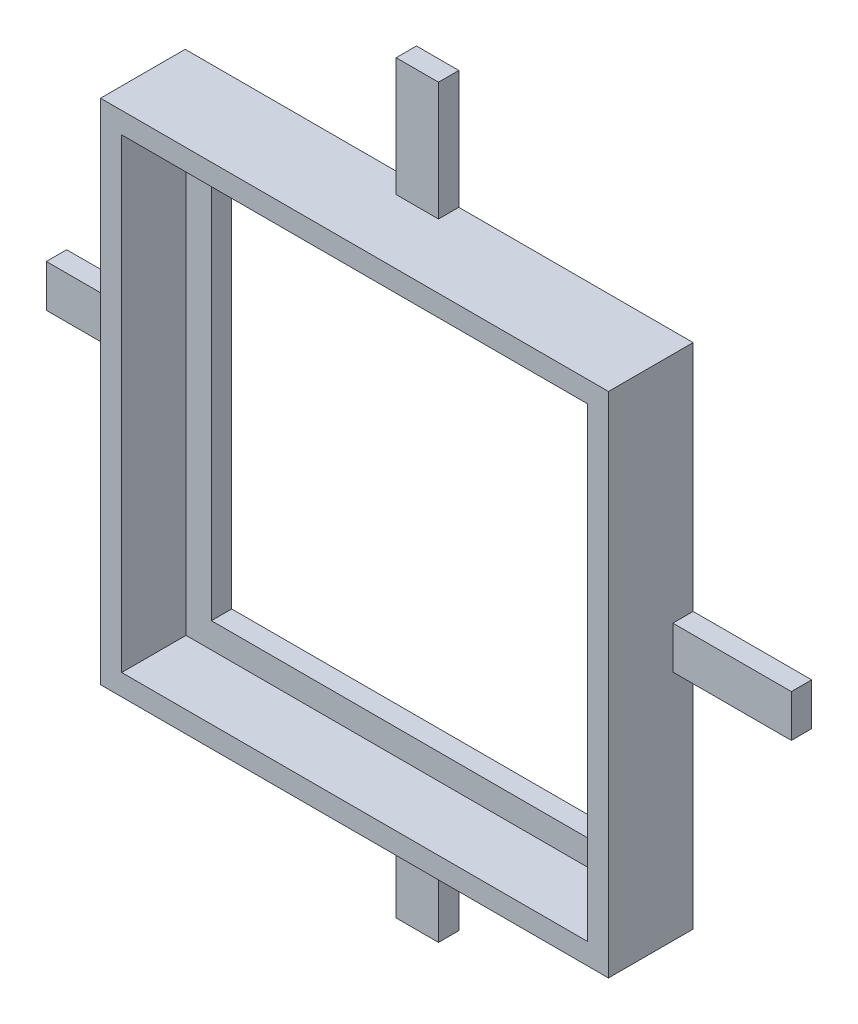
ISO-10303-21;
HEADER;
FILE_DESCRIPTION(('STEP AP214'),'2;1');
FILE_NAME('part.step','',(''),(''),'','','');
FILE_SCHEMA(('AUTOMOTIVE_DESIGN { 1 0 10303 214 1 1 1 1 }'));
ENDSEC;
DATA;
#1=APPLICATION_CONTEXT('core data for automotive mechanical design processes');
#2=APPLICATION_PROTOCOL_DEFINITION('international standard','automotive_design',2000,#1);
#3=PRODUCT_CONTEXT('',#1,'mechanical');
#4=PRODUCT('Part','Part','',(#3));
#5=PRODUCT_RELATED_PRODUCT_CATEGORY('part','',(#4));
#6=PRODUCT_DEFINITION_FORMATION('','',#4);
#7=PRODUCT_DEFINITION_CONTEXT('part definition',#1,'design');
#8=PRODUCT_DEFINITION('design','',#6,#7);
#9=PRODUCT_DEFINITION_SHAPE('','',#8);
#10=(LENGTH_UNIT() NAMED_UNIT(*) SI_UNIT(.MILLI.,.METRE.));
#11=(NAMED_UNIT(*) PLANE_ANGLE_UNIT() SI_UNIT($,.RADIAN.));
#12=(NAMED_UNIT(*) SI_UNIT($,.STERADIAN.) SOLID_ANGLE_UNIT());
#13=UNCERTAINTY_MEASURE_WITH_UNIT(LENGTH_MEASURE(1.E-05),#10,'distance_accuracy_value','');
#14=(GEOMETRIC_REPRESENTATION_CONTEXT(3) GLOBAL_UNCERTAINTY_ASSIGNED_CONTEXT((#13)) GLOBAL_UNIT_ASSIGNED_CONTEXT((#10,
#11,#12)) REPRESENTATION_CONTEXT('',''));
#15=CARTESIAN_POINT('',(0.,0.,0.));
#16=DIRECTION('',(0.,0.,1.));
#17=DIRECTION('',(1.,0.,0.));
#18=AXIS2_PLACEMENT_3D('',#15,#16,#17);
#19=CARTESIAN_POINT('',(150.,150.,50.));
#20=DIRECTION('',(-1.,0.,0.));
#21=DIRECTION('',(0.,0.,1.));
#22=AXIS2_PLACEMENT_3D('',#19,#20,#21);
#23=PLANE('',#22);
#24=DIRECTION('',(0.,0.,-1.));
#25=VECTOR('',#24,1.);
#26=CARTESIAN_POINT('',(150.,-12.5,12.));
#27=LINE('',#26,#25);
#28=CARTESIAN_POINT('',(150.,-12.5,12.));
#29=VERTEX_POINT('',#28);
#30=CARTESIAN_POINT('',(150.,-12.5,0.));
#31=VERTEX_POINT('',#30);
#32=EDGE_CURVE('E280',#29,#31,#27,.T.);
#33=ORIENTED_EDGE('',*,*,#32,.F.);
#34=DIRECTION('',(0.,-1.,0.));
#35=VECTOR('',#34,1.);
#36=CARTESIAN_POINT('',(150.,-12.5,12.));
#37=LINE('',#36,#35);
#38=CARTESIAN_POINT('',(150.,12.5,12.));
#39=VERTEX_POINT('',#38);
#40=EDGE_CURVE('E257',#39,#29,#37,.T.);
#41=ORIENTED_EDGE('',*,*,#40,.F.);
#42=DIRECTION('',(0.,0.,-1.));
#43=VECTOR('',#42,1.);
#44=CARTESIAN_POINT('',(150.,12.5,12.));
#45=LINE('',#44,#43);
#46=CARTESIAN_POINT('',(150.,12.5,0.));
#47=VERTEX_POINT('',#46);
#48=EDGE_CURVE('E253',#39,#47,#45,.T.);
#49=ORIENTED_EDGE('',*,*,#48,.T.);
#50=DIRECTION('',(0.,1.,0.));
#51=VECTOR('',#50,1.);
#52=CARTESIAN_POINT('',(150.,150.,0.));
#53=LINE('',#52,#51);
#54=CARTESIAN_POINT('',(150.,150.,0.));
#55=VERTEX_POINT('',#54);
#56=EDGE_CURVE('E477',#47,#55,#53,.T.);
#57=ORIENTED_EDGE('',*,*,#56,.T.);
#58=DIRECTION('',(0.,0.,-1.));
#59=VECTOR('',#58,1.);
#60=CARTESIAN_POINT('',(150.,150.,50.));
#61=LINE('',#60,#59);
#62=CARTESIAN_POINT('',(150.,150.,50.));
#63=VERTEX_POINT('',#62);
#64=EDGE_CURVE('E12',#63,#55,#61,.T.);
#65=ORIENTED_EDGE('',*,*,#64,.F.);
#66=DIRECTION('',(0.,1.,0.));
#67=VECTOR('',#66,1.);
#68=CARTESIAN_POINT('',(150.,150.,50.));
#69=LINE('',#68,#67);
#70=CARTESIAN_POINT('',(150.,-150.,50.));
#71=VERTEX_POINT('',#70);
#72=EDGE_CURVE('E478',#71,#63,#69,.T.);
#73=ORIENTED_EDGE('',*,*,#72,.F.);
#74=DIRECTION('',(0.,0.,-1.));
#75=VECTOR('',#74,1.);
#76=CARTESIAN_POINT('',(150.,-150.,50.));
#77=LINE('',#76,#75);
#78=CARTESIAN_POINT('',(150.,-150.,0.));
#79=VERTEX_POINT('',#78);
#80=EDGE_CURVE('E492',#71,#79,#77,.T.);
#81=ORIENTED_EDGE('',*,*,#80,.T.);
#82=EDGE_CURVE('E493',#79,#31,#53,.T.);
#83=ORIENTED_EDGE('',*,*,#82,.T.);
#84=EDGE_LOOP('',(#33,#41,#49,#57,#65,#73,#81,#83));
#85=FACE_BOUND('',#84,.T.);
#86=ADVANCED_FACE('F63',(#85),#23,.F.);
#87=CARTESIAN_POINT('',(-150.,150.,50.));
#88=DIRECTION('',(1.,0.,0.));
#89=DIRECTION('',(0.,0.,-1.));
#90=AXIS2_PLACEMENT_3D('',#87,#88,#89);
#91=PLANE('',#90);
#92=DIRECTION('',(0.,0.,-1.));
#93=VECTOR('',#92,1.);
#94=CARTESIAN_POINT('',(-150.,12.5000000000001,12.));
#95=LINE('',#94,#93);
#96=CARTESIAN_POINT('',(-150.,12.5000000000001,12.));
#97=VERTEX_POINT('',#96);
#98=CARTESIAN_POINT('',(-150.,12.5000000000001,0.));
#99=VERTEX_POINT('',#98);
#100=EDGE_CURVE('E306',#97,#99,#95,.T.);
#101=ORIENTED_EDGE('',*,*,#100,.F.);
#102=DIRECTION('',(0.,1.,0.));
#103=VECTOR('',#102,1.);
#104=CARTESIAN_POINT('',(-150.,-12.4999999999999,12.));
#105=LINE('',#104,#103);
#106=CARTESIAN_POINT('',(-150.,-12.4999999999999,12.));
#107=VERTEX_POINT('',#106);
#108=EDGE_CURVE('E292',#107,#97,#105,.T.);
#109=ORIENTED_EDGE('',*,*,#108,.F.);
#110=DIRECTION('',(0.,0.,-1.));
#111=VECTOR('',#110,1.);
#112=CARTESIAN_POINT('',(-150.,-12.4999999999999,12.));
#113=LINE('',#112,#111);
#114=CARTESIAN_POINT('',(-150.,-12.4999999999999,0.));
#115=VERTEX_POINT('',#114);
#116=EDGE_CURVE('E309',#107,#115,#113,.T.);
#117=ORIENTED_EDGE('',*,*,#116,.T.);
#118=DIRECTION('',(0.,-1.,0.));
#119=VECTOR('',#118,1.);
#120=CARTESIAN_POINT('',(-150.,150.,0.));
#121=LINE('',#120,#119);
#122=CARTESIAN_POINT('',(-150.,-150.,0.));
#123=VERTEX_POINT('',#122);
#124=EDGE_CURVE('E502',#115,#123,#121,.T.);
#125=ORIENTED_EDGE('',*,*,#124,.T.);
#126=DIRECTION('',(0.,0.,-1.));
#127=VECTOR('',#126,1.);
#128=CARTESIAN_POINT('',(-150.,-150.,50.));
#129=LINE('',#128,#127);
#130=CARTESIAN_POINT('',(-150.,-150.,50.));
#131=VERTEX_POINT('',#130);
#132=EDGE_CURVE('E514',#131,#123,#129,.T.);
#133=ORIENTED_EDGE('',*,*,#132,.F.);
#134=DIRECTION('',(0.,-1.,0.));
#135=VECTOR('',#134,1.);
#136=CARTESIAN_POINT('',(-150.,150.,50.));
#137=LINE('',#136,#135);
#138=CARTESIAN_POINT('',(-150.,150.,50.));
#139=VERTEX_POINT('',#138);
#140=EDGE_CURVE('E486',#139,#131,#137,.T.);
#141=ORIENTED_EDGE('',*,*,#140,.F.);
#142=DIRECTION('',(0.,0.,-1.));
#143=VECTOR('',#142,1.);
#144=CARTESIAN_POINT('',(-150.,150.,50.));
#145=LINE('',#144,#143);
#146=CARTESIAN_POINT('',(-150.,150.,0.));
#147=VERTEX_POINT('',#146);
#148=EDGE_CURVE('E71',#139,#147,#145,.T.);
#149=ORIENTED_EDGE('',*,*,#148,.T.);
#150=EDGE_CURVE('E503',#147,#99,#121,.T.);
#151=ORIENTED_EDGE('',*,*,#150,.T.);
#152=EDGE_LOOP('',(#101,#109,#117,#125,#133,#141,#149,#151));
#153=FACE_BOUND('',#152,.T.);
#154=ADVANCED_FACE('F524',(#153),#91,.F.);
#155=CARTESIAN_POINT('',(-150.,-150.,50.));
#156=DIRECTION('',(0.,1.,0.));
#157=DIRECTION('',(0.,0.,1.));
#158=AXIS2_PLACEMENT_3D('',#155,#156,#157);
#159=PLANE('',#158);
#160=DIRECTION('',(0.,0.,-1.));
#161=VECTOR('',#160,1.);
#162=CARTESIAN_POINT('',(-13.3901658606512,-150.,12.));
#163=LINE('',#162,#161);
#164=CARTESIAN_POINT('',(-13.3901658606512,-150.,12.));
#165=VERTEX_POINT('',#164);
#166=CARTESIAN_POINT('',(-13.3901658606512,-150.,0.));
#167=VERTEX_POINT('',#166);
#168=EDGE_CURVE('E330',#165,#167,#163,.T.);
#169=ORIENTED_EDGE('',*,*,#168,.F.);
#170=DIRECTION('',(-1.,0.,0.));
#171=VECTOR('',#170,1.);
#172=CARTESIAN_POINT('',(-13.3901658606512,-150.,12.));
#173=LINE('',#172,#171);
#174=CARTESIAN_POINT('',(11.6098341393488,-150.,12.));
#175=VERTEX_POINT('',#174);
#176=EDGE_CURVE('E327',#175,#165,#173,.T.);
#177=ORIENTED_EDGE('',*,*,#176,.F.);
#178=DIRECTION('',(0.,0.,-1.));
#179=VECTOR('',#178,1.);
#180=CARTESIAN_POINT('',(11.6098341393488,-150.,12.));
#181=LINE('',#180,#179);
#182=CARTESIAN_POINT('',(11.6098341393488,-150.,0.));
#183=VERTEX_POINT('',#182);
#184=EDGE_CURVE('E341',#175,#183,#181,.T.);
#185=ORIENTED_EDGE('',*,*,#184,.T.);
#186=DIRECTION('',(1.,0.,0.));
#187=VECTOR('',#186,1.);
#188=CARTESIAN_POINT('',(-150.,-150.,0.));
#189=LINE('',#188,#187);
#190=EDGE_CURVE('E507',#183,#79,#189,.T.);
#191=ORIENTED_EDGE('',*,*,#190,.T.);
#192=ORIENTED_EDGE('',*,*,#80,.F.);
#193=DIRECTION('',(1.,0.,0.));
#194=VECTOR('',#193,1.);
#195=CARTESIAN_POINT('',(-150.,-150.,50.));
#196=LINE('',#195,#194);
#197=EDGE_CURVE('E489',#131,#71,#196,.T.);
#198=ORIENTED_EDGE('',*,*,#197,.F.);
#199=ORIENTED_EDGE('',*,*,#132,.T.);
#200=EDGE_CURVE('E483',#123,#167,#189,.T.);
#201=ORIENTED_EDGE('',*,*,#200,.T.);
#202=EDGE_LOOP('',(#169,#177,#185,#191,#192,#198,#199,#201));
#203=FACE_BOUND('',#202,.T.);
#204=ADVANCED_FACE('F599',(#203),#159,.F.);
#205=CARTESIAN_POINT('',(-150.,150.,50.));
#206=DIRECTION('',(0.,-1.,0.));
#207=DIRECTION('',(0.,0.,-1.));
#208=AXIS2_PLACEMENT_3D('',#205,#206,#207);
#209=PLANE('',#208);
#210=DIRECTION('',(0.,0.,-1.));
#211=VECTOR('',#210,1.);
#212=CARTESIAN_POINT('',(11.6098341393487,150.,12.));
#213=LINE('',#212,#211);
#214=CARTESIAN_POINT('',(11.6098341393487,150.,12.));
#215=VERTEX_POINT('',#214);
#216=CARTESIAN_POINT('',(11.6098341393487,150.,0.));
#217=VERTEX_POINT('',#216);
#218=EDGE_CURVE('E368',#215,#217,#213,.T.);
#219=ORIENTED_EDGE('',*,*,#218,.F.);
#220=DIRECTION('',(1.,0.,0.));
#221=VECTOR('',#220,1.);
#222=CARTESIAN_POINT('',(-13.3901658606513,150.,12.));
#223=LINE('',#222,#221);
#224=CARTESIAN_POINT('',(-13.3901658606513,150.,12.));
#225=VERTEX_POINT('',#224);
#226=EDGE_CURVE('E365',#225,#215,#223,.T.);
#227=ORIENTED_EDGE('',*,*,#226,.F.);
#228=DIRECTION('',(0.,0.,-1.));
#229=VECTOR('',#228,1.);
#230=CARTESIAN_POINT('',(-13.3901658606513,150.,12.));
#231=LINE('',#230,#229);
#232=CARTESIAN_POINT('',(-13.3901658606513,150.,0.));
#233=VERTEX_POINT('',#232);
#234=EDGE_CURVE('E379',#225,#233,#231,.T.);
#235=ORIENTED_EDGE('',*,*,#234,.T.);
#236=DIRECTION('',(-1.,0.,0.));
#237=VECTOR('',#236,1.);
#238=CARTESIAN_POINT('',(-150.,150.,0.));
#239=LINE('',#238,#237);
#240=EDGE_CURVE('E497',#233,#147,#239,.T.);
#241=ORIENTED_EDGE('',*,*,#240,.T.);
#242=ORIENTED_EDGE('',*,*,#148,.F.);
#243=DIRECTION('',(-1.,0.,0.));
#244=VECTOR('',#243,1.);
#245=CARTESIAN_POINT('',(-150.,150.,50.));
#246=LINE('',#245,#244);
#247=EDGE_CURVE('E482',#63,#139,#246,.T.);
#248=ORIENTED_EDGE('',*,*,#247,.F.);
#249=ORIENTED_EDGE('',*,*,#64,.T.);
#250=EDGE_CURVE('E498',#55,#217,#239,.T.);
#251=ORIENTED_EDGE('',*,*,#250,.T.);
#252=EDGE_LOOP('',(#219,#227,#235,#241,#242,#248,#249,#251));
#253=FACE_BOUND('',#252,.T.);
#254=ADVANCED_FACE('F561',(#253),#209,.F.);
#255=CARTESIAN_POINT('',(137.5,137.5,50.));
#256=DIRECTION('',(-1.,0.,0.));
#257=DIRECTION('',(0.,-1.,0.));
#258=AXIS2_PLACEMENT_3D('',#255,#256,#257);
#259=PLANE('',#258);
#260=DIRECTION('',(0.,0.,-1.));
#261=VECTOR('',#260,1.);
#262=CARTESIAN_POINT('',(137.5,137.5,50.));
#263=LINE('',#262,#261);
#264=CARTESIAN_POINT('',(137.5,137.5,50.));
#265=VERTEX_POINT('',#264);
#266=CARTESIAN_POINT('',(137.5,137.5,12.));
#267=VERTEX_POINT('',#266);
#268=EDGE_CURVE('E473',#265,#267,#263,.T.);
#269=ORIENTED_EDGE('',*,*,#268,.T.);
#270=DIRECTION('',(0.,-1.,0.));
#271=VECTOR('',#270,1.);
#272=CARTESIAN_POINT('',(137.5,137.5,12.));
#273=LINE('',#272,#271);
#274=CARTESIAN_POINT('',(137.5,-137.5,12.));
#275=VERTEX_POINT('',#274);
#276=EDGE_CURVE('E437',#267,#275,#273,.T.);
#277=ORIENTED_EDGE('',*,*,#276,.T.);
#278=DIRECTION('',(0.,0.,-1.));
#279=VECTOR('',#278,1.);
#280=CARTESIAN_POINT('',(137.5,-137.5,50.));
#281=LINE('',#280,#279);
#282=CARTESIAN_POINT('',(137.5,-137.5,50.));
#283=VERTEX_POINT('',#282);
#284=EDGE_CURVE('E461',#283,#275,#281,.T.);
#285=ORIENTED_EDGE('',*,*,#284,.F.);
#286=DIRECTION('',(0.,1.,0.));
#287=VECTOR('',#286,1.);
#288=CARTESIAN_POINT('',(137.5,137.5,50.));
#289=LINE('',#288,#287);
#290=EDGE_CURVE('E448',#283,#265,#289,.T.);
#291=ORIENTED_EDGE('',*,*,#290,.T.);
#292=EDGE_LOOP('',(#269,#277,#285,#291));
#293=FACE_BOUND('',#292,.T.);
#294=ADVANCED_FACE('F607',(#293),#259,.T.);
#295=CARTESIAN_POINT('',(-137.5,137.5,50.));
#296=DIRECTION('',(0.,-1.,0.));
#297=DIRECTION('',(0.,0.,-1.));
#298=AXIS2_PLACEMENT_3D('',#295,#296,#297);
#299=PLANE('',#298);
#300=DIRECTION('',(0.,0.,-1.));
#301=VECTOR('',#300,1.);
#302=CARTESIAN_POINT('',(-137.5,137.5,50.));
#303=LINE('',#302,#301);
#304=CARTESIAN_POINT('',(-137.5,137.5,50.));
#305=VERTEX_POINT('',#304);
#306=CARTESIAN_POINT('',(-137.5,137.5,12.));
#307=VERTEX_POINT('',#306);
#308=EDGE_CURVE('E469',#305,#307,#303,.T.);
#309=ORIENTED_EDGE('',*,*,#308,.T.);
#310=DIRECTION('',(1.,0.,0.));
#311=VECTOR('',#310,1.);
#312=CARTESIAN_POINT('',(-137.5,137.5,12.));
#313=LINE('',#312,#311);
#314=EDGE_CURVE('E441',#307,#267,#313,.T.);
#315=ORIENTED_EDGE('',*,*,#314,.T.);
#316=ORIENTED_EDGE('',*,*,#268,.F.);
#317=DIRECTION('',(-1.,0.,0.));
#318=VECTOR('',#317,1.);
#319=CARTESIAN_POINT('',(-137.5,137.5,50.));
#320=LINE('',#319,#318);
#321=EDGE_CURVE('E451',#265,#305,#320,.T.);
#322=ORIENTED_EDGE('',*,*,#321,.T.);
#323=EDGE_LOOP('',(#309,#315,#316,#322));
#324=FACE_BOUND('',#323,.T.);
#325=ADVANCED_FACE('F611',(#324),#299,.T.);
#326=CARTESIAN_POINT('',(-137.5,137.5,50.));
#327=DIRECTION('',(1.,0.,0.));
#328=DIRECTION('',(0.,1.,0.));
#329=AXIS2_PLACEMENT_3D('',#326,#327,#328);
#330=PLANE('',#329);
#331=DIRECTION('',(0.,0.,-1.));
#332=VECTOR('',#331,1.);
#333=CARTESIAN_POINT('',(-137.5,-137.5,50.));
#334=LINE('',#333,#332);
#335=CARTESIAN_POINT('',(-137.5,-137.5,50.));
#336=VERTEX_POINT('',#335);
#337=CARTESIAN_POINT('',(-137.5,-137.5,12.));
#338=VERTEX_POINT('',#337);
#339=EDGE_CURVE('E465',#336,#338,#334,.T.);
#340=ORIENTED_EDGE('',*,*,#339,.T.);
#341=DIRECTION('',(0.,-1.,0.));
#342=VECTOR('',#341,1.);
#343=CARTESIAN_POINT('',(-137.5,137.5,12.));
#344=LINE('',#343,#342);
#345=EDGE_CURVE('E445',#307,#338,#344,.T.);
#346=ORIENTED_EDGE('',*,*,#345,.F.);
#347=ORIENTED_EDGE('',*,*,#308,.F.);
#348=DIRECTION('',(0.,-1.,0.));
#349=VECTOR('',#348,1.);
#350=CARTESIAN_POINT('',(-137.5,137.5,50.));
#351=LINE('',#350,#349);
#352=EDGE_CURVE('E454',#305,#336,#351,.T.);
#353=ORIENTED_EDGE('',*,*,#352,.T.);
#354=EDGE_LOOP('',(#340,#346,#347,#353));
#355=FACE_BOUND('',#354,.T.);
#356=ADVANCED_FACE('F617',(#355),#330,.T.);
#357=CARTESIAN_POINT('',(-137.5,-137.5,50.));
#358=DIRECTION('',(0.,1.,0.));
#359=DIRECTION('',(0.,0.,1.));
#360=AXIS2_PLACEMENT_3D('',#357,#358,#359);
#361=PLANE('',#360);
#362=ORIENTED_EDGE('',*,*,#284,.T.);
#363=DIRECTION('',(1.,0.,0.));
#364=VECTOR('',#363,1.);
#365=CARTESIAN_POINT('',(-137.5,-137.5,12.));
#366=LINE('',#365,#364);
#367=EDGE_CURVE('E434',#338,#275,#366,.T.);
#368=ORIENTED_EDGE('',*,*,#367,.F.);
#369=ORIENTED_EDGE('',*,*,#339,.F.);
#370=DIRECTION('',(1.,0.,0.));
#371=VECTOR('',#370,1.);
#372=CARTESIAN_POINT('',(-137.5,-137.5,50.));
#373=LINE('',#372,#371);
#374=EDGE_CURVE('E458',#336,#283,#373,.T.);
#375=ORIENTED_EDGE('',*,*,#374,.T.);
#376=EDGE_LOOP('',(#362,#368,#369,#375));
#377=FACE_BOUND('',#376,.T.);
#378=ADVANCED_FACE('F623',(#377),#361,.T.);
#379=CARTESIAN_POINT('',(0.,0.,50.));
#380=DIRECTION('',(0.,0.,1.));
#381=DIRECTION('',(1.,0.,0.));
#382=AXIS2_PLACEMENT_3D('',#379,#380,#381);
#383=PLANE('',#382);
#384=ORIENTED_EDGE('',*,*,#72,.T.);
#385=ORIENTED_EDGE('',*,*,#247,.T.);
#386=ORIENTED_EDGE('',*,*,#140,.T.);
#387=ORIENTED_EDGE('',*,*,#197,.T.);
#388=EDGE_LOOP('',(#384,#385,#386,#387));
#389=FACE_BOUND('',#388,.T.);
#390=ORIENTED_EDGE('',*,*,#321,.F.);
#391=ORIENTED_EDGE('',*,*,#290,.F.);
#392=ORIENTED_EDGE('',*,*,#374,.F.);
#393=ORIENTED_EDGE('',*,*,#352,.F.);
#394=EDGE_LOOP('',(#390,#391,#392,#393));
#395=FACE_BOUND('',#394,.T.);
#396=ADVANCED_FACE('F563',(#389,#395),#383,.T.);
#397=CARTESIAN_POINT('',(0.,0.,0.));
#398=DIRECTION('',(0.,0.,1.));
#399=DIRECTION('',(1.,0.,0.));
#400=AXIS2_PLACEMENT_3D('',#397,#398,#399);
#401=PLANE('',#400);
#402=ORIENTED_EDGE('',*,*,#82,.F.);
#403=ORIENTED_EDGE('',*,*,#190,.F.);
#404=DIRECTION('',(0.,1.,0.));
#405=VECTOR('',#404,1.);
#406=CARTESIAN_POINT('',(11.6098341393488,-150.,0.));
#407=LINE('',#406,#405);
#408=CARTESIAN_POINT('',(11.6098341393488,-220.,0.));
#409=VERTEX_POINT('',#408);
#410=EDGE_CURVE('E321',#409,#183,#407,.T.);
#411=ORIENTED_EDGE('',*,*,#410,.F.);
#412=DIRECTION('',(1.,0.,0.));
#413=VECTOR('',#412,1.);
#414=CARTESIAN_POINT('',(-13.3901658606512,-220.,0.));
#415=LINE('',#414,#413);
#416=CARTESIAN_POINT('',(-13.3901658606512,-220.,0.));
#417=VERTEX_POINT('',#416);
#418=EDGE_CURVE('E334',#417,#409,#415,.T.);
#419=ORIENTED_EDGE('',*,*,#418,.F.);
#420=DIRECTION('',(0.,-1.,0.));
#421=VECTOR('',#420,1.);
#422=CARTESIAN_POINT('',(-13.3901658606512,-150.,0.));
#423=LINE('',#422,#421);
#424=EDGE_CURVE('E315',#167,#417,#423,.T.);
#425=ORIENTED_EDGE('',*,*,#424,.F.);
#426=ORIENTED_EDGE('',*,*,#200,.F.);
#427=ORIENTED_EDGE('',*,*,#124,.F.);
#428=DIRECTION('',(1.,0.,0.));
#429=VECTOR('',#428,1.);
#430=CARTESIAN_POINT('',(-150.,-12.4999999999999,0.));
#431=LINE('',#430,#429);
#432=CARTESIAN_POINT('',(-220.,-12.4999999999998,0.));
#433=VERTEX_POINT('',#432);
#434=EDGE_CURVE('E86',#433,#115,#431,.T.);
#435=ORIENTED_EDGE('',*,*,#434,.F.);
#436=DIRECTION('',(0.,-1.,0.));
#437=VECTOR('',#436,1.);
#438=CARTESIAN_POINT('',(-220.,12.5000000000002,0.));
#439=LINE('',#438,#437);
#440=CARTESIAN_POINT('',(-220.,12.5000000000002,0.));
#441=VERTEX_POINT('',#440);
#442=EDGE_CURVE('E274',#441,#433,#439,.T.);
#443=ORIENTED_EDGE('',*,*,#442,.F.);
#444=DIRECTION('',(-1.,0.,0.));
#445=VECTOR('',#444,1.);
#446=CARTESIAN_POINT('',(-150.,12.5000000000001,0.));
#447=LINE('',#446,#445);
#448=EDGE_CURVE('E289',#99,#441,#447,.T.);
#449=ORIENTED_EDGE('',*,*,#448,.F.);
#450=ORIENTED_EDGE('',*,*,#150,.F.);
#451=ORIENTED_EDGE('',*,*,#240,.F.);
#452=DIRECTION('',(0.,-1.,0.));
#453=VECTOR('',#452,1.);
#454=CARTESIAN_POINT('',(-13.3901658606513,150.,0.));
#455=LINE('',#454,#453);
#456=CARTESIAN_POINT('',(-13.3901658606513,220.,0.));
#457=VERTEX_POINT('',#456);
#458=EDGE_CURVE('E359',#457,#233,#455,.T.);
#459=ORIENTED_EDGE('',*,*,#458,.F.);
#460=DIRECTION('',(-1.,0.,0.));
#461=VECTOR('',#460,1.);
#462=CARTESIAN_POINT('',(-13.3901658606513,220.,0.));
#463=LINE('',#462,#461);
#464=CARTESIAN_POINT('',(11.6098341393487,220.,0.));
#465=VERTEX_POINT('',#464);
#466=EDGE_CURVE('E372',#465,#457,#463,.T.);
#467=ORIENTED_EDGE('',*,*,#466,.F.);
#468=DIRECTION('',(0.,1.,0.));
#469=VECTOR('',#468,1.);
#470=CARTESIAN_POINT('',(11.6098341393487,150.,0.));
#471=LINE('',#470,#469);
#472=EDGE_CURVE('E353',#217,#465,#471,.T.);
#473=ORIENTED_EDGE('',*,*,#472,.F.);
#474=ORIENTED_EDGE('',*,*,#250,.F.);
#475=ORIENTED_EDGE('',*,*,#56,.F.);
#476=DIRECTION('',(-1.,0.,0.));
#477=VECTOR('',#476,1.);
#478=CARTESIAN_POINT('',(150.,12.5,0.));
#479=LINE('',#478,#477);
#480=CARTESIAN_POINT('',(220.,12.5,0.));
#481=VERTEX_POINT('',#480);
#482=EDGE_CURVE('E78',#481,#47,#479,.T.);
#483=ORIENTED_EDGE('',*,*,#482,.F.);
#484=DIRECTION('',(0.,1.,0.));
#485=VECTOR('',#484,1.);
#486=CARTESIAN_POINT('',(220.,12.5,0.));
#487=LINE('',#486,#485);
#488=CARTESIAN_POINT('',(220.,-12.5,0.));
#489=VERTEX_POINT('',#488);
#490=EDGE_CURVE('E272',#489,#481,#487,.T.);
#491=ORIENTED_EDGE('',*,*,#490,.F.);
#492=DIRECTION('',(1.,0.,0.));
#493=VECTOR('',#492,1.);
#494=CARTESIAN_POINT('',(150.,-12.5,0.));
#495=LINE('',#494,#493);
#496=EDGE_CURVE('E268',#31,#489,#495,.T.);
#497=ORIENTED_EDGE('',*,*,#496,.F.);
#498=EDGE_LOOP('',(#402,#403,#411,#419,#425,#426,#427,#435,#443,#449,#450,#451,#459,#467,#473,
#474,#475,#483,#491,#497));
#499=FACE_BOUND('',#498,.T.);
#500=DIRECTION('',(0.,-1.,0.));
#501=VECTOR('',#500,1.);
#502=CARTESIAN_POINT('',(-122.5,122.5,0.));
#503=LINE('',#502,#501);
#504=CARTESIAN_POINT('',(-122.5,122.5,0.));
#505=VERTEX_POINT('',#504);
#506=CARTESIAN_POINT('',(-122.5,-122.5,0.));
#507=VERTEX_POINT('',#506);
#508=EDGE_CURVE('E396',#505,#507,#503,.T.);
#509=ORIENTED_EDGE('',*,*,#508,.T.);
#510=DIRECTION('',(1.,0.,0.));
#511=VECTOR('',#510,1.);
#512=CARTESIAN_POINT('',(-122.5,-122.5,0.));
#513=LINE('',#512,#511);
#514=CARTESIAN_POINT('',(122.5,-122.5,0.));
#515=VERTEX_POINT('',#514);
#516=EDGE_CURVE('E391',#507,#515,#513,.T.);
#517=ORIENTED_EDGE('',*,*,#516,.T.);
#518=DIRECTION('',(0.,-1.,0.));
#519=VECTOR('',#518,1.);
#520=CARTESIAN_POINT('',(122.5,122.5,0.));
#521=LINE('',#520,#519);
#522=CARTESIAN_POINT('',(122.5,122.5,0.));
#523=VERTEX_POINT('',#522);
#524=EDGE_CURVE('E411',#523,#515,#521,.T.);
#525=ORIENTED_EDGE('',*,*,#524,.F.);
#526=DIRECTION('',(1.,0.,0.));
#527=VECTOR('',#526,1.);
#528=CARTESIAN_POINT('',(-122.5,122.5,0.));
#529=LINE('',#528,#527);
#530=EDGE_CURVE('E415',#505,#523,#529,.T.);
#531=ORIENTED_EDGE('',*,*,#530,.F.);
#532=EDGE_LOOP('',(#509,#517,#525,#531));
#533=FACE_BOUND('',#532,.T.);
#534=ADVANCED_FACE('F531',(#499,#533),#401,.F.);
#535=CARTESIAN_POINT('',(0.,0.,12.));
#536=DIRECTION('',(0.,0.,-1.));
#537=DIRECTION('',(-1.,0.,0.));
#538=AXIS2_PLACEMENT_3D('',#535,#536,#537);
#539=PLANE('',#538);
#540=ORIENTED_EDGE('',*,*,#367,.T.);
#541=ORIENTED_EDGE('',*,*,#276,.F.);
#542=ORIENTED_EDGE('',*,*,#314,.F.);
#543=ORIENTED_EDGE('',*,*,#345,.T.);
#544=EDGE_LOOP('',(#540,#541,#542,#543));
#545=FACE_BOUND('',#544,.T.);
#546=DIRECTION('',(1.,0.,0.));
#547=VECTOR('',#546,1.);
#548=CARTESIAN_POINT('',(-122.5,-122.5,12.));
#549=LINE('',#548,#547);
#550=CARTESIAN_POINT('',(-122.5,-122.5,12.));
#551=VERTEX_POINT('',#550);
#552=CARTESIAN_POINT('',(122.5,-122.5,12.));
#553=VERTEX_POINT('',#552);
#554=EDGE_CURVE('E392',#551,#553,#549,.T.);
#555=ORIENTED_EDGE('',*,*,#554,.F.);
#556=DIRECTION('',(0.,-1.,0.));
#557=VECTOR('',#556,1.);
#558=CARTESIAN_POINT('',(-122.5,122.5,12.));
#559=LINE('',#558,#557);
#560=CARTESIAN_POINT('',(-122.5,122.5,12.));
#561=VERTEX_POINT('',#560);
#562=EDGE_CURVE('E404',#561,#551,#559,.T.);
#563=ORIENTED_EDGE('',*,*,#562,.F.);
#564=DIRECTION('',(1.,0.,0.));
#565=VECTOR('',#564,1.);
#566=CARTESIAN_POINT('',(-122.5,122.5,12.));
#567=LINE('',#566,#565);
#568=CARTESIAN_POINT('',(122.5,122.5,12.));
#569=VERTEX_POINT('',#568);
#570=EDGE_CURVE('E400',#561,#569,#567,.T.);
#571=ORIENTED_EDGE('',*,*,#570,.T.);
#572=DIRECTION('',(0.,-1.,0.));
#573=VECTOR('',#572,1.);
#574=CARTESIAN_POINT('',(122.5,122.5,12.));
#575=LINE('',#574,#573);
#576=EDGE_CURVE('E395',#569,#553,#575,.T.);
#577=ORIENTED_EDGE('',*,*,#576,.T.);
#578=EDGE_LOOP('',(#555,#563,#571,#577));
#579=FACE_BOUND('',#578,.T.);
#580=ADVANCED_FACE('F625',(#545,#579),#539,.F.);
#581=CARTESIAN_POINT('',(-122.5,-122.5,12.));
#582=DIRECTION('',(0.,1.,0.));
#583=DIRECTION('',(0.,0.,1.));
#584=AXIS2_PLACEMENT_3D('',#581,#582,#583);
#585=PLANE('',#584);
#586=ORIENTED_EDGE('',*,*,#516,.F.);
#587=DIRECTION('',(0.,0.,-1.));
#588=VECTOR('',#587,1.);
#589=CARTESIAN_POINT('',(-122.5,-122.5,12.));
#590=LINE('',#589,#588);
#591=EDGE_CURVE('E407',#551,#507,#590,.T.);
#592=ORIENTED_EDGE('',*,*,#591,.F.);
#593=ORIENTED_EDGE('',*,*,#554,.T.);
#594=DIRECTION('',(0.,0.,-1.));
#595=VECTOR('',#594,1.);
#596=CARTESIAN_POINT('',(122.5,-122.5,12.));
#597=LINE('',#596,#595);
#598=EDGE_CURVE('E431',#553,#515,#597,.T.);
#599=ORIENTED_EDGE('',*,*,#598,.T.);
#600=EDGE_LOOP('',(#586,#592,#593,#599));
#601=FACE_BOUND('',#600,.T.);
#602=ADVANCED_FACE('F629',(#601),#585,.T.);
#603=CARTESIAN_POINT('',(122.5,122.5,12.));
#604=DIRECTION('',(1.,0.,0.));
#605=DIRECTION('',(0.,1.,0.));
#606=AXIS2_PLACEMENT_3D('',#603,#604,#605);
#607=PLANE('',#606);
#608=ORIENTED_EDGE('',*,*,#524,.T.);
#609=ORIENTED_EDGE('',*,*,#598,.F.);
#610=ORIENTED_EDGE('',*,*,#576,.F.);
#611=DIRECTION('',(0.,0.,-1.));
#612=VECTOR('',#611,1.);
#613=CARTESIAN_POINT('',(122.5,122.5,12.));
#614=LINE('',#613,#612);
#615=EDGE_CURVE('E428',#569,#523,#614,.T.);
#616=ORIENTED_EDGE('',*,*,#615,.T.);
#617=EDGE_LOOP('',(#608,#609,#610,#616));
#618=FACE_BOUND('',#617,.T.);
#619=ADVANCED_FACE('F635',(#618),#607,.F.);
#620=CARTESIAN_POINT('',(-122.5,122.5,12.));
#621=DIRECTION('',(0.,1.,0.));
#622=DIRECTION('',(0.,0.,1.));
#623=AXIS2_PLACEMENT_3D('',#620,#621,#622);
#624=PLANE('',#623);
#625=ORIENTED_EDGE('',*,*,#530,.T.);
#626=ORIENTED_EDGE('',*,*,#615,.F.);
#627=ORIENTED_EDGE('',*,*,#570,.F.);
#628=DIRECTION('',(0.,0.,-1.));
#629=VECTOR('',#628,1.);
#630=CARTESIAN_POINT('',(-122.5,122.5,12.));
#631=LINE('',#630,#629);
#632=EDGE_CURVE('E425',#561,#505,#631,.T.);
#633=ORIENTED_EDGE('',*,*,#632,.T.);
#634=EDGE_LOOP('',(#625,#626,#627,#633));
#635=FACE_BOUND('',#634,.T.);
#636=ADVANCED_FACE('F708',(#635),#624,.F.);
#637=CARTESIAN_POINT('',(-122.5,122.5,12.));
#638=DIRECTION('',(1.,0.,0.));
#639=DIRECTION('',(0.,1.,0.));
#640=AXIS2_PLACEMENT_3D('',#637,#638,#639);
#641=PLANE('',#640);
#642=ORIENTED_EDGE('',*,*,#508,.F.);
#643=ORIENTED_EDGE('',*,*,#632,.F.);
#644=ORIENTED_EDGE('',*,*,#562,.T.);
#645=ORIENTED_EDGE('',*,*,#591,.T.);
#646=EDGE_LOOP('',(#642,#643,#644,#645));
#647=FACE_BOUND('',#646,.T.);
#648=ADVANCED_FACE('F716',(#647),#641,.T.);
#649=CARTESIAN_POINT('',(11.6098341393487,150.,12.));
#650=DIRECTION('',(-1.,0.,0.));
#651=DIRECTION('',(0.,0.,1.));
#652=AXIS2_PLACEMENT_3D('',#649,#650,#651);
#653=PLANE('',#652);
#654=ORIENTED_EDGE('',*,*,#472,.T.);
#655=DIRECTION('',(0.,0.,-1.));
#656=VECTOR('',#655,1.);
#657=CARTESIAN_POINT('',(11.6098341393487,220.,12.));
#658=LINE('',#657,#656);
#659=CARTESIAN_POINT('',(11.6098341393487,220.,12.));
#660=VERTEX_POINT('',#659);
#661=EDGE_CURVE('E387',#660,#465,#658,.T.);
#662=ORIENTED_EDGE('',*,*,#661,.F.);
#663=DIRECTION('',(0.,1.,0.));
#664=VECTOR('',#663,1.);
#665=CARTESIAN_POINT('',(11.6098341393487,150.,12.));
#666=LINE('',#665,#664);
#667=EDGE_CURVE('E354',#215,#660,#666,.T.);
#668=ORIENTED_EDGE('',*,*,#667,.F.);
#669=ORIENTED_EDGE('',*,*,#218,.T.);
#670=EDGE_LOOP('',(#654,#662,#668,#669));
#671=FACE_BOUND('',#670,.T.);
#672=ADVANCED_FACE('F725',(#671),#653,.F.);
#673=CARTESIAN_POINT('',(-13.3901658606513,220.,12.));
#674=DIRECTION('',(0.,-1.,0.));
#675=DIRECTION('',(0.,0.,-1.));
#676=AXIS2_PLACEMENT_3D('',#673,#674,#675);
#677=PLANE('',#676);
#678=ORIENTED_EDGE('',*,*,#466,.T.);
#679=DIRECTION('',(0.,0.,-1.));
#680=VECTOR('',#679,1.);
#681=CARTESIAN_POINT('',(-13.3901658606513,220.,12.));
#682=LINE('',#681,#680);
#683=CARTESIAN_POINT('',(-13.3901658606513,220.,12.));
#684=VERTEX_POINT('',#683);
#685=EDGE_CURVE('E383',#684,#457,#682,.T.);
#686=ORIENTED_EDGE('',*,*,#685,.F.);
#687=DIRECTION('',(-1.,0.,0.));
#688=VECTOR('',#687,1.);
#689=CARTESIAN_POINT('',(-13.3901658606513,220.,12.));
#690=LINE('',#689,#688);
#691=EDGE_CURVE('E358',#660,#684,#690,.T.);
#692=ORIENTED_EDGE('',*,*,#691,.F.);
#693=ORIENTED_EDGE('',*,*,#661,.T.);
#694=EDGE_LOOP('',(#678,#686,#692,#693));
#695=FACE_BOUND('',#694,.T.);
#696=ADVANCED_FACE('F755',(#695),#677,.F.);
#697=CARTESIAN_POINT('',(-13.3901658606513,150.,12.));
#698=DIRECTION('',(1.,0.,0.));
#699=DIRECTION('',(0.,0.,-1.));
#700=AXIS2_PLACEMENT_3D('',#697,#698,#699);
#701=PLANE('',#700);
#702=ORIENTED_EDGE('',*,*,#458,.T.);
#703=ORIENTED_EDGE('',*,*,#234,.F.);
#704=DIRECTION('',(0.,-1.,0.));
#705=VECTOR('',#704,1.);
#706=CARTESIAN_POINT('',(-13.3901658606513,150.,12.));
#707=LINE('',#706,#705);
#708=EDGE_CURVE('E362',#684,#225,#707,.T.);
#709=ORIENTED_EDGE('',*,*,#708,.F.);
#710=ORIENTED_EDGE('',*,*,#685,.T.);
#711=EDGE_LOOP('',(#702,#703,#709,#710));
#712=FACE_BOUND('',#711,.T.);
#713=ADVANCED_FACE('F765',(#712),#701,.F.);
#714=CARTESIAN_POINT('',(0.,0.,12.));
#715=DIRECTION('',(0.,0.,-1.));
#716=DIRECTION('',(-1.,0.,0.));
#717=AXIS2_PLACEMENT_3D('',#714,#715,#716);
#718=PLANE('',#717);
#719=ORIENTED_EDGE('',*,*,#667,.T.);
#720=ORIENTED_EDGE('',*,*,#691,.T.);
#721=ORIENTED_EDGE('',*,*,#708,.T.);
#722=ORIENTED_EDGE('',*,*,#226,.T.);
#723=EDGE_LOOP('',(#719,#720,#721,#722));
#724=FACE_BOUND('',#723,.T.);
#725=ADVANCED_FACE('F775',(#724),#718,.F.);
#726=CARTESIAN_POINT('',(-13.3901658606512,-150.,12.));
#727=DIRECTION('',(1.,0.,0.));
#728=DIRECTION('',(0.,1.,0.));
#729=AXIS2_PLACEMENT_3D('',#726,#727,#728);
#730=PLANE('',#729);
#731=ORIENTED_EDGE('',*,*,#424,.T.);
#732=DIRECTION('',(0.,0.,-1.));
#733=VECTOR('',#732,1.);
#734=CARTESIAN_POINT('',(-13.3901658606512,-220.,12.));
#735=LINE('',#734,#733);
#736=CARTESIAN_POINT('',(-13.3901658606512,-220.,12.));
#737=VERTEX_POINT('',#736);
#738=EDGE_CURVE('E349',#737,#417,#735,.T.);
#739=ORIENTED_EDGE('',*,*,#738,.F.);
#740=DIRECTION('',(0.,-1.,0.));
#741=VECTOR('',#740,1.);
#742=CARTESIAN_POINT('',(-13.3901658606512,-150.,12.));
#743=LINE('',#742,#741);
#744=EDGE_CURVE('E316',#165,#737,#743,.T.);
#745=ORIENTED_EDGE('',*,*,#744,.F.);
#746=ORIENTED_EDGE('',*,*,#168,.T.);
#747=EDGE_LOOP('',(#731,#739,#745,#746));
#748=FACE_BOUND('',#747,.T.);
#749=ADVANCED_FACE('F785',(#748),#730,.F.);
#750=CARTESIAN_POINT('',(-13.3901658606512,-220.,12.));
#751=DIRECTION('',(0.,1.,0.));
#752=DIRECTION('',(0.,0.,1.));
#753=AXIS2_PLACEMENT_3D('',#750,#751,#752);
#754=PLANE('',#753);
#755=ORIENTED_EDGE('',*,*,#418,.T.);
#756=DIRECTION('',(0.,0.,-1.));
#757=VECTOR('',#756,1.);
#758=CARTESIAN_POINT('',(11.6098341393488,-220.,12.));
#759=LINE('',#758,#757);
#760=CARTESIAN_POINT('',(11.6098341393488,-220.,12.));
#761=VERTEX_POINT('',#760);
#762=EDGE_CURVE('E345',#761,#409,#759,.T.);
#763=ORIENTED_EDGE('',*,*,#762,.F.);
#764=DIRECTION('',(1.,0.,0.));
#765=VECTOR('',#764,1.);
#766=CARTESIAN_POINT('',(-13.3901658606512,-220.,12.));
#767=LINE('',#766,#765);
#768=EDGE_CURVE('E320',#737,#761,#767,.T.);
#769=ORIENTED_EDGE('',*,*,#768,.F.);
#770=ORIENTED_EDGE('',*,*,#738,.T.);
#771=EDGE_LOOP('',(#755,#763,#769,#770));
#772=FACE_BOUND('',#771,.T.);
#773=ADVANCED_FACE('F795',(#772),#754,.F.);
#774=CARTESIAN_POINT('',(11.6098341393488,-150.,12.));
#775=DIRECTION('',(-1.,0.,0.));
#776=DIRECTION('',(0.,-1.,0.));
#777=AXIS2_PLACEMENT_3D('',#774,#775,#776);
#778=PLANE('',#777);
#779=ORIENTED_EDGE('',*,*,#410,.T.);
#780=ORIENTED_EDGE('',*,*,#184,.F.);
#781=DIRECTION('',(0.,1.,0.));
#782=VECTOR('',#781,1.);
#783=CARTESIAN_POINT('',(11.6098341393488,-150.,12.));
#784=LINE('',#783,#782);
#785=EDGE_CURVE('E324',#761,#175,#784,.T.);
#786=ORIENTED_EDGE('',*,*,#785,.F.);
#787=ORIENTED_EDGE('',*,*,#762,.T.);
#788=EDGE_LOOP('',(#779,#780,#786,#787));
#789=FACE_BOUND('',#788,.T.);
#790=ADVANCED_FACE('F805',(#789),#778,.F.);
#791=CARTESIAN_POINT('',(0.,0.,12.));
#792=DIRECTION('',(0.,0.,1.));
#793=DIRECTION('',(1.,0.,0.));
#794=AXIS2_PLACEMENT_3D('',#791,#792,#793);
#795=PLANE('',#794);
#796=ORIENTED_EDGE('',*,*,#744,.T.);
#797=ORIENTED_EDGE('',*,*,#768,.T.);
#798=ORIENTED_EDGE('',*,*,#785,.T.);
#799=ORIENTED_EDGE('',*,*,#176,.T.);
#800=EDGE_LOOP('',(#796,#797,#798,#799));
#801=FACE_BOUND('',#800,.T.);
#802=ADVANCED_FACE('F815',(#801),#795,.T.);
#803=CARTESIAN_POINT('',(-220.,12.5000000000002,12.));
#804=DIRECTION('',(1.,0.,0.));
#805=DIRECTION('',(0.,0.,-1.));
#806=AXIS2_PLACEMENT_3D('',#803,#804,#805);
#807=PLANE('',#806);
#808=ORIENTED_EDGE('',*,*,#442,.T.);
#809=DIRECTION('',(0.,0.,-1.));
#810=VECTOR('',#809,1.);
#811=CARTESIAN_POINT('',(-220.,-12.4999999999998,12.));
#812=LINE('',#811,#810);
#813=CARTESIAN_POINT('',(-220.,-12.4999999999998,12.));
#814=VERTEX_POINT('',#813);
#815=EDGE_CURVE('E312',#814,#433,#812,.T.);
#816=ORIENTED_EDGE('',*,*,#815,.F.);
#817=DIRECTION('',(0.,-1.,0.));
#818=VECTOR('',#817,1.);
#819=CARTESIAN_POINT('',(-220.,12.5000000000002,12.));
#820=LINE('',#819,#818);
#821=CARTESIAN_POINT('',(-220.,12.5000000000002,12.));
#822=VERTEX_POINT('',#821);
#823=EDGE_CURVE('E284',#822,#814,#820,.T.);
#824=ORIENTED_EDGE('',*,*,#823,.F.);
#825=DIRECTION('',(0.,0.,-1.));
#826=VECTOR('',#825,1.);
#827=CARTESIAN_POINT('',(-220.,12.5000000000002,12.));
#828=LINE('',#827,#826);
#829=EDGE_CURVE('E297',#822,#441,#828,.T.);
#830=ORIENTED_EDGE('',*,*,#829,.T.);
#831=EDGE_LOOP('',(#808,#816,#824,#830));
#832=FACE_BOUND('',#831,.T.);
#833=ADVANCED_FACE('F541',(#832),#807,.F.);
#834=CARTESIAN_POINT('',(-150.,-12.4999999999999,12.));
#835=DIRECTION('',(0.,1.,0.));
#836=DIRECTION('',(-1.,0.,0.));
#837=AXIS2_PLACEMENT_3D('',#834,#835,#836);
#838=PLANE('',#837);
#839=ORIENTED_EDGE('',*,*,#434,.T.);
#840=ORIENTED_EDGE('',*,*,#116,.F.);
#841=DIRECTION('',(1.,0.,0.));
#842=VECTOR('',#841,1.);
#843=CARTESIAN_POINT('',(-150.,-12.4999999999999,12.));
#844=LINE('',#843,#842);
#845=EDGE_CURVE('E288',#814,#107,#844,.T.);
#846=ORIENTED_EDGE('',*,*,#845,.F.);
#847=ORIENTED_EDGE('',*,*,#815,.T.);
#848=EDGE_LOOP('',(#839,#840,#846,#847));
#849=FACE_BOUND('',#848,.T.);
#850=ADVANCED_FACE('F834',(#849),#838,.F.);
#851=CARTESIAN_POINT('',(-150.,12.5000000000001,12.));
#852=DIRECTION('',(0.,-1.,0.));
#853=DIRECTION('',(1.,0.,0.));
#854=AXIS2_PLACEMENT_3D('',#851,#852,#853);
#855=PLANE('',#854);
#856=ORIENTED_EDGE('',*,*,#448,.T.);
#857=ORIENTED_EDGE('',*,*,#829,.F.);
#858=DIRECTION('',(-1.,0.,0.));
#859=VECTOR('',#858,1.);
#860=CARTESIAN_POINT('',(-150.,12.5000000000001,12.));
#861=LINE('',#860,#859);
#862=EDGE_CURVE('E295',#97,#822,#861,.T.);
#863=ORIENTED_EDGE('',*,*,#862,.F.);
#864=ORIENTED_EDGE('',*,*,#100,.T.);
#865=EDGE_LOOP('',(#856,#857,#863,#864));
#866=FACE_BOUND('',#865,.T.);
#867=ADVANCED_FACE('F537',(#866),#855,.F.);
#868=CARTESIAN_POINT('',(0.,0.,12.));
#869=DIRECTION('',(0.,0.,-1.));
#870=DIRECTION('',(-1.,0.,0.));
#871=AXIS2_PLACEMENT_3D('',#868,#869,#870);
#872=PLANE('',#871);
#873=ORIENTED_EDGE('',*,*,#823,.T.);
#874=ORIENTED_EDGE('',*,*,#845,.T.);
#875=ORIENTED_EDGE('',*,*,#108,.T.);
#876=ORIENTED_EDGE('',*,*,#862,.T.);
#877=EDGE_LOOP('',(#873,#874,#875,#876));
#878=FACE_BOUND('',#877,.T.);
#879=ADVANCED_FACE('F544',(#878),#872,.F.);
#880=CARTESIAN_POINT('',(220.,12.5,12.));
#881=DIRECTION('',(-1.,0.,0.));
#882=DIRECTION('',(0.,0.,1.));
#883=AXIS2_PLACEMENT_3D('',#880,#881,#882);
#884=PLANE('',#883);
#885=ORIENTED_EDGE('',*,*,#490,.T.);
#886=DIRECTION('',(0.,0.,-1.));
#887=VECTOR('',#886,1.);
#888=CARTESIAN_POINT('',(220.,12.5,12.));
#889=LINE('',#888,#887);
#890=CARTESIAN_POINT('',(220.,12.5,12.));
#891=VERTEX_POINT('',#890);
#892=EDGE_CURVE('E251',#891,#481,#889,.T.);
#893=ORIENTED_EDGE('',*,*,#892,.F.);
#894=DIRECTION('',(0.,1.,0.));
#895=VECTOR('',#894,1.);
#896=CARTESIAN_POINT('',(220.,12.5,12.));
#897=LINE('',#896,#895);
#898=CARTESIAN_POINT('',(220.,-12.5,12.));
#899=VERTEX_POINT('',#898);
#900=EDGE_CURVE('E258',#899,#891,#897,.T.);
#901=ORIENTED_EDGE('',*,*,#900,.F.);
#902=DIRECTION('',(0.,0.,-1.));
#903=VECTOR('',#902,1.);
#904=CARTESIAN_POINT('',(220.,-12.5,12.));
#905=LINE('',#904,#903);
#906=EDGE_CURVE('E578',#899,#489,#905,.T.);
#907=ORIENTED_EDGE('',*,*,#906,.T.);
#908=EDGE_LOOP('',(#885,#893,#901,#907));
#909=FACE_BOUND('',#908,.T.);
#910=ADVANCED_FACE('F270',(#909),#884,.F.);
#911=CARTESIAN_POINT('',(150.,12.5,12.));
#912=DIRECTION('',(0.,-1.,0.));
#913=DIRECTION('',(0.,0.,-1.));
#914=AXIS2_PLACEMENT_3D('',#911,#912,#913);
#915=PLANE('',#914);
#916=ORIENTED_EDGE('',*,*,#482,.T.);
#917=ORIENTED_EDGE('',*,*,#48,.F.);
#918=DIRECTION('',(-1.,0.,0.));
#919=VECTOR('',#918,1.);
#920=CARTESIAN_POINT('',(150.,12.5,12.));
#921=LINE('',#920,#919);
#922=EDGE_CURVE('E247',#891,#39,#921,.T.);
#923=ORIENTED_EDGE('',*,*,#922,.F.);
#924=ORIENTED_EDGE('',*,*,#892,.T.);
#925=EDGE_LOOP('',(#916,#917,#923,#924));
#926=FACE_BOUND('',#925,.T.);
#927=ADVANCED_FACE('F249',(#926),#915,.F.);
#928=CARTESIAN_POINT('',(150.,-12.5,12.));
#929=DIRECTION('',(0.,1.,0.));
#930=DIRECTION('',(0.,0.,1.));
#931=AXIS2_PLACEMENT_3D('',#928,#929,#930);
#932=PLANE('',#931);
#933=ORIENTED_EDGE('',*,*,#496,.T.);
#934=ORIENTED_EDGE('',*,*,#906,.F.);
#935=DIRECTION('',(1.,0.,0.));
#936=VECTOR('',#935,1.);
#937=CARTESIAN_POINT('',(150.,-12.5,12.));
#938=LINE('',#937,#936);
#939=EDGE_CURVE('E263',#29,#899,#938,.T.);
#940=ORIENTED_EDGE('',*,*,#939,.F.);
#941=ORIENTED_EDGE('',*,*,#32,.T.);
#942=EDGE_LOOP('',(#933,#934,#940,#941));
#943=FACE_BOUND('',#942,.T.);
#944=ADVANCED_FACE('F581',(#943),#932,.F.);
#945=CARTESIAN_POINT('',(0.,0.,12.));
#946=DIRECTION('',(0.,0.,1.));
#947=DIRECTION('',(1.,0.,0.));
#948=AXIS2_PLACEMENT_3D('',#945,#946,#947);
#949=PLANE('',#948);
#950=ORIENTED_EDGE('',*,*,#900,.T.);
#951=ORIENTED_EDGE('',*,*,#922,.T.);
#952=ORIENTED_EDGE('',*,*,#40,.T.);
#953=ORIENTED_EDGE('',*,*,#939,.T.);
#954=EDGE_LOOP('',(#950,#951,#952,#953));
#955=FACE_BOUND('',#954,.T.);
#956=ADVANCED_FACE('F261',(#955),#949,.T.);
#957=CLOSED_SHELL('',(#86,#154,#204,#254,#294,#325,#356,#378,#396,#534,#580,#602,#619,#636,#648,
#672,#696,#713,#725,#749,#773,#790,#802,#833,#850,#867,#879,#910,#927,#944,#956));
#958=MANIFOLD_SOLID_BREP('B2',#957);
#959=ADVANCED_BREP_SHAPE_REPRESENTATION('',(#18,#958),#14);
#960=SHAPE_DEFINITION_REPRESENTATION(#9,#959);
ENDSEC;
END-ISO-10303-21;
